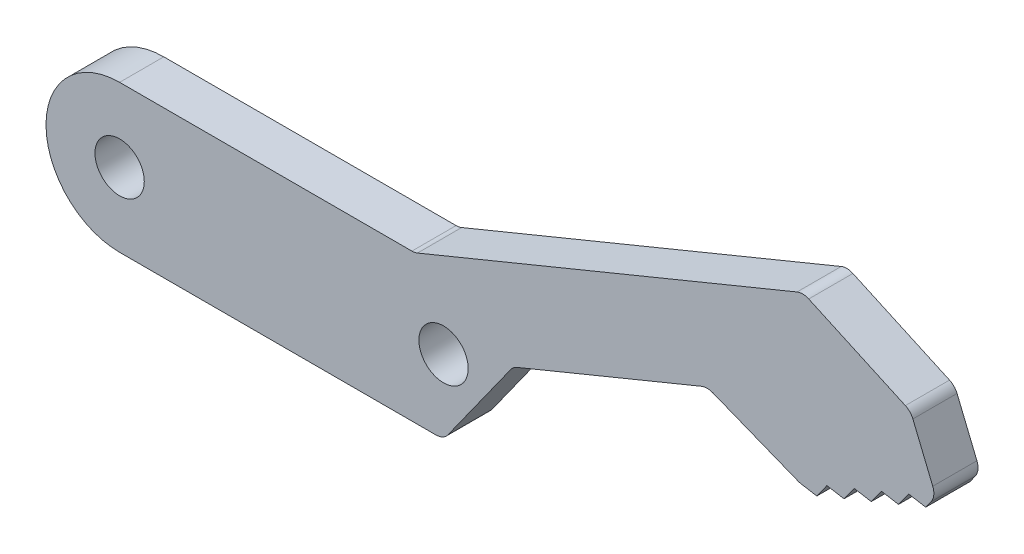
ISO-10303-21;
HEADER;
FILE_DESCRIPTION(('STEP AP214'),'2;1');
FILE_NAME('part.step','',(''),(''),'','','');
FILE_SCHEMA(('AUTOMOTIVE_DESIGN { 1 0 10303 214 1 1 1 1 }'));
ENDSEC;
DATA;
#1=APPLICATION_CONTEXT('core data for automotive mechanical design processes');
#2=APPLICATION_PROTOCOL_DEFINITION('international standard','automotive_design',2000,#1);
#3=PRODUCT_CONTEXT('',#1,'mechanical');
#4=PRODUCT('Part','Part','',(#3));
#5=PRODUCT_RELATED_PRODUCT_CATEGORY('part','',(#4));
#6=PRODUCT_DEFINITION_FORMATION('','',#4);
#7=PRODUCT_DEFINITION_CONTEXT('part definition',#1,'design');
#8=PRODUCT_DEFINITION('design','',#6,#7);
#9=PRODUCT_DEFINITION_SHAPE('','',#8);
#10=(LENGTH_UNIT() NAMED_UNIT(*) SI_UNIT(.MILLI.,.METRE.));
#11=(NAMED_UNIT(*) PLANE_ANGLE_UNIT() SI_UNIT($,.RADIAN.));
#12=(NAMED_UNIT(*) SI_UNIT($,.STERADIAN.) SOLID_ANGLE_UNIT());
#13=UNCERTAINTY_MEASURE_WITH_UNIT(LENGTH_MEASURE(1.E-05),#10,'distance_accuracy_value','');
#14=(GEOMETRIC_REPRESENTATION_CONTEXT(3) GLOBAL_UNCERTAINTY_ASSIGNED_CONTEXT((#13)) GLOBAL_UNIT_ASSIGNED_CONTEXT((#10,
#11,#12)) REPRESENTATION_CONTEXT('',''));
#15=CARTESIAN_POINT('',(0.,0.,0.));
#16=DIRECTION('',(0.,0.,1.));
#17=DIRECTION('',(1.,0.,0.));
#18=AXIS2_PLACEMENT_3D('',#15,#16,#17);
#19=CARTESIAN_POINT('',(16.9314341640704,-12.0952117619831,3.));
#20=DIRECTION('',(0.813703233651604,-0.581280523968353,0.));
#21=DIRECTION('',(0.581280523968353,0.813703233651604,0.));
#22=AXIS2_PLACEMENT_3D('',#19,#20,#21);
#23=PLANE('',#22);
#24=DIRECTION('',(-0.581280523968353,-0.813703233651604,0.));
#25=VECTOR('',#24,1.);
#26=CARTESIAN_POINT('',(16.9314341640704,-12.0952117619831,0.));
#27=LINE('',#26,#25);
#28=CARTESIAN_POINT('',(26.562618493048,1.38696338278467,0.));
#29=VERTEX_POINT('',#28);
#30=CARTESIAN_POINT('',(22.2991182366711,-4.58128052396835,0.));
#31=VERTEX_POINT('',#30);
#32=EDGE_CURVE('E330',#29,#31,#27,.T.);
#33=ORIENTED_EDGE('',*,*,#32,.F.);
#34=DIRECTION('',(0.,0.,-1.));
#35=VECTOR('',#34,1.);
#36=CARTESIAN_POINT('',(26.562618493048,1.38696338278467,3.));
#37=LINE('',#36,#35);
#38=CARTESIAN_POINT('',(26.562618493048,1.38696338278467,3.));
#39=VERTEX_POINT('',#38);
#40=EDGE_CURVE('E316',#29,#39,#37,.F.);
#41=ORIENTED_EDGE('',*,*,#40,.T.);
#42=DIRECTION('',(-0.581280523968353,-0.813703233651604,0.));
#43=VECTOR('',#42,1.);
#44=CARTESIAN_POINT('',(16.9314341640704,-12.0952117619831,3.));
#45=LINE('',#44,#43);
#46=CARTESIAN_POINT('',(22.2991182366711,-4.58128052396835,3.));
#47=VERTEX_POINT('',#46);
#48=EDGE_CURVE('E348',#39,#47,#45,.T.);
#49=ORIENTED_EDGE('',*,*,#48,.T.);
#50=DIRECTION('',(0.,0.,-1.));
#51=VECTOR('',#50,1.);
#52=CARTESIAN_POINT('',(22.2991182366711,-4.58128052396835,0.));
#53=LINE('',#52,#51);
#54=EDGE_CURVE('E313',#47,#31,#53,.T.);
#55=ORIENTED_EDGE('',*,*,#54,.T.);
#56=EDGE_LOOP('',(#33,#41,#49,#55));
#57=FACE_BOUND('',#56,.T.);
#58=ADVANCED_FACE('F49',(#57),#23,.T.);
#59=CARTESIAN_POINT('',(3.29500338314039,-8.01412070884607,3.));
#60=DIRECTION('',(0.380263412733207,-0.924878228166549,0.));
#61=DIRECTION('',(0.924878228166549,0.380263412733207,0.));
#62=AXIS2_PLACEMENT_3D('',#59,#60,#61);
#63=PLANE('',#62);
#64=DIRECTION('',(-0.924878228166549,-0.380263412733207,0.));
#65=VECTOR('',#64,1.);
#66=CARTESIAN_POINT('',(3.29500338314039,-8.01412070884607,0.));
#67=LINE('',#66,#65);
#68=CARTESIAN_POINT('',(39.5264893293259,6.88244413040183,0.));
#69=VERTEX_POINT('',#68);
#70=CARTESIAN_POINT('',(26.9960583139664,1.73056108698286,0.));
#71=VERTEX_POINT('',#70);
#72=EDGE_CURVE('E332',#69,#71,#67,.T.);
#73=ORIENTED_EDGE('',*,*,#72,.F.);
#74=DIRECTION('',(0.,0.,-1.));
#75=VECTOR('',#74,1.);
#76=CARTESIAN_POINT('',(39.5264893293259,6.88244413040184,3.));
#77=LINE('',#76,#75);
#78=CARTESIAN_POINT('',(39.5264893293259,6.88244413040183,3.));
#79=VERTEX_POINT('',#78);
#80=EDGE_CURVE('E311',#69,#79,#77,.F.);
#81=ORIENTED_EDGE('',*,*,#80,.T.);
#82=DIRECTION('',(-0.924878228166549,-0.380263412733207,0.));
#83=VECTOR('',#82,1.);
#84=CARTESIAN_POINT('',(3.29500338314039,-8.01412070884607,3.));
#85=LINE('',#84,#83);
#86=CARTESIAN_POINT('',(26.9960583139664,1.73056108698286,3.));
#87=VERTEX_POINT('',#86);
#88=EDGE_CURVE('E346',#79,#87,#85,.T.);
#89=ORIENTED_EDGE('',*,*,#88,.T.);
#90=DIRECTION('',(0.,0.,-1.));
#91=VECTOR('',#90,1.);
#92=CARTESIAN_POINT('',(26.9960583139664,1.73056108698286,0.));
#93=LINE('',#92,#91);
#94=EDGE_CURVE('E308',#87,#71,#93,.T.);
#95=ORIENTED_EDGE('',*,*,#94,.T.);
#96=EDGE_LOOP('',(#73,#81,#89,#95));
#97=FACE_BOUND('',#96,.T.);
#98=ADVANCED_FACE('F350',(#97),#63,.T.);
#99=CARTESIAN_POINT('',(7.84369243763637,19.7605066346556,3.));
#100=DIRECTION('',(-0.368935795459582,-0.929454882621317,0.));
#101=DIRECTION('',(0.929454882621317,-0.368935795459582,0.));
#102=AXIS2_PLACEMENT_3D('',#99,#100,#101);
#103=PLANE('',#102);
#104=DIRECTION('',(-0.929454882621317,0.368935795459582,0.));
#105=VECTOR('',#104,1.);
#106=CARTESIAN_POINT('',(7.84369243763637,19.7605066346556,0.));
#107=LINE('',#106,#105);
#108=CARTESIAN_POINT('',(46.0908425261848,4.57876623410547,0.));
#109=VERTEX_POINT('',#108);
#110=CARTESIAN_POINT('',(40.2756885375187,6.8870207848566,0.));
#111=VERTEX_POINT('',#110);
#112=EDGE_CURVE('E404',#109,#111,#107,.T.);
#113=ORIENTED_EDGE('',*,*,#112,.F.);
#114=DIRECTION('',(0.,0.,-1.));
#115=VECTOR('',#114,1.);
#116=CARTESIAN_POINT('',(46.0908425261848,4.57876623410548,3.));
#117=LINE('',#116,#115);
#118=CARTESIAN_POINT('',(46.0908425261848,4.57876623410547,3.));
#119=VERTEX_POINT('',#118);
#120=EDGE_CURVE('E277',#109,#119,#117,.F.);
#121=ORIENTED_EDGE('',*,*,#120,.T.);
#122=DIRECTION('',(-0.929454882621317,0.368935795459582,0.));
#123=VECTOR('',#122,1.);
#124=CARTESIAN_POINT('',(7.84369243763637,19.7605066346556,3.));
#125=LINE('',#124,#123);
#126=CARTESIAN_POINT('',(40.2756885375187,6.8870207848566,3.));
#127=VERTEX_POINT('',#126);
#128=EDGE_CURVE('E242',#119,#127,#125,.T.);
#129=ORIENTED_EDGE('',*,*,#128,.T.);
#130=DIRECTION('',(0.,0.,-1.));
#131=VECTOR('',#130,1.);
#132=CARTESIAN_POINT('',(40.2756885375187,6.8870207848566,0.));
#133=LINE('',#132,#131);
#134=EDGE_CURVE('E274',#127,#111,#133,.T.);
#135=ORIENTED_EDGE('',*,*,#134,.T.);
#136=EDGE_LOOP('',(#113,#121,#129,#135));
#137=FACE_BOUND('',#136,.T.);
#138=ADVANCED_FACE('F558',(#137),#103,.T.);
#139=CARTESIAN_POINT('',(2.04998063607053,12.0493696274544,3.));
#140=DIRECTION('',(0.167721751487352,0.985834374567054,0.));
#141=DIRECTION('',(-0.985834374567054,0.167721751487352,0.));
#142=AXIS2_PLACEMENT_3D('',#139,#140,#141);
#143=PLANE('',#142);
#144=DIRECTION('',(0.985834374567054,-0.167721751487352,0.));
#145=VECTOR('',#144,1.);
#146=CARTESIAN_POINT('',(2.04998063607053,12.0493696274544,3.));
#147=LINE('',#146,#145);
#148=CARTESIAN_POINT('',(46.2920565701571,4.52238674215974,3.));
#149=VERTEX_POINT('',#148);
#150=CARTESIAN_POINT('',(47.3510308865052,4.3422215625919,3.));
#151=VERTEX_POINT('',#150);
#152=EDGE_CURVE('E229',#149,#151,#147,.T.);
#153=ORIENTED_EDGE('',*,*,#152,.F.);
#154=DIRECTION('',(0.,0.,-1.));
#155=VECTOR('',#154,1.);
#156=CARTESIAN_POINT('',(46.2920565701571,4.52238674215974,0.));
#157=LINE('',#156,#155);
#158=CARTESIAN_POINT('',(46.2920565701571,4.52238674215974,0.));
#159=VERTEX_POINT('',#158);
#160=EDGE_CURVE('E257',#149,#159,#157,.T.);
#161=ORIENTED_EDGE('',*,*,#160,.T.);
#162=DIRECTION('',(0.985834374567054,-0.167721751487352,0.));
#163=VECTOR('',#162,1.);
#164=CARTESIAN_POINT('',(2.04998063607053,12.0493696274544,0.));
#165=LINE('',#164,#163);
#166=CARTESIAN_POINT('',(47.3510308865052,4.3422215625919,0.));
#167=VERTEX_POINT('',#166);
#168=EDGE_CURVE('E255',#159,#167,#165,.T.);
#169=ORIENTED_EDGE('',*,*,#168,.T.);
#170=DIRECTION('',(0.,0.,-1.));
#171=VECTOR('',#170,1.);
#172=CARTESIAN_POINT('',(47.3510308865052,4.3422215625919,3.));
#173=LINE('',#172,#171);
#174=EDGE_CURVE('E248',#151,#167,#173,.T.);
#175=ORIENTED_EDGE('',*,*,#174,.F.);
#176=EDGE_LOOP('',(#153,#161,#169,#175));
#177=FACE_BOUND('',#176,.T.);
#178=ADVANCED_FACE('F253',(#177),#143,.F.);
#179=CARTESIAN_POINT('',(29.2140395089282,-20.9496267653803,3.));
#180=DIRECTION('',(-0.812647209633238,0.582755963225871,0.));
#181=DIRECTION('',(-0.582755963225871,-0.812647209633238,0.));
#182=AXIS2_PLACEMENT_3D('',#179,#180,#181);
#183=PLANE('',#182);
#184=DIRECTION('',(0.582755963225871,0.812647209633238,0.));
#185=VECTOR('',#184,1.);
#186=CARTESIAN_POINT('',(29.2140395089282,-20.9496267653803,0.));
#187=LINE('',#186,#185);
#188=CARTESIAN_POINT('',(48.0382444817135,5.3005338679292,0.));
#189=VERTEX_POINT('',#188);
#190=EDGE_CURVE('E408',#167,#189,#187,.T.);
#191=ORIENTED_EDGE('',*,*,#190,.T.);
#192=DIRECTION('',(0.,0.,-1.));
#193=VECTOR('',#192,1.);
#194=CARTESIAN_POINT('',(48.0382444817135,5.3005338679292,3.));
#195=LINE('',#194,#193);
#196=CARTESIAN_POINT('',(48.0382444817135,5.3005338679292,3.));
#197=VERTEX_POINT('',#196);
#198=EDGE_CURVE('E250',#197,#189,#195,.T.);
#199=ORIENTED_EDGE('',*,*,#198,.F.);
#200=DIRECTION('',(0.582755963225871,0.812647209633238,0.));
#201=VECTOR('',#200,1.);
#202=CARTESIAN_POINT('',(29.2140395089282,-20.9496267653803,3.));
#203=LINE('',#202,#201);
#204=EDGE_CURVE('E234',#151,#197,#203,.T.);
#205=ORIENTED_EDGE('',*,*,#204,.F.);
#206=ORIENTED_EDGE('',*,*,#174,.T.);
#207=EDGE_LOOP('',(#191,#199,#205,#206));
#208=FACE_BOUND('',#207,.T.);
#209=ADVANCED_FACE('F247',(#208),#183,.F.);
#210=CARTESIAN_POINT('',(2.22776533707793,13.0943519745326,3.));
#211=DIRECTION('',(0.167721751487345,0.985834374567055,0.));
#212=DIRECTION('',(-0.985834374567056,0.167721751487345,0.));
#213=AXIS2_PLACEMENT_3D('',#210,#211,#212);
#214=PLANE('',#213);
#215=DIRECTION('',(0.985834374567055,-0.167721751487345,0.));
#216=VECTOR('',#215,1.);
#217=CARTESIAN_POINT('',(2.22776533707793,13.0943519745326,0.));
#218=LINE('',#217,#216);
#219=CARTESIAN_POINT('',(49.2007873428382,5.10274838805831,0.));
#220=VERTEX_POINT('',#219);
#221=EDGE_CURVE('E410',#189,#220,#218,.T.);
#222=ORIENTED_EDGE('',*,*,#221,.T.);
#223=DIRECTION('',(0.,0.,-1.));
#224=VECTOR('',#223,1.);
#225=CARTESIAN_POINT('',(49.2007873428382,5.10274838805831,3.));
#226=LINE('',#225,#224);
#227=CARTESIAN_POINT('',(49.2007873428382,5.10274838805831,3.));
#228=VERTEX_POINT('',#227);
#229=EDGE_CURVE('E261',#228,#220,#226,.T.);
#230=ORIENTED_EDGE('',*,*,#229,.F.);
#231=DIRECTION('',(0.985834374567055,-0.167721751487345,0.));
#232=VECTOR('',#231,1.);
#233=CARTESIAN_POINT('',(2.22776533707793,13.0943519745326,3.));
#234=LINE('',#233,#232);
#235=EDGE_CURVE('E251',#197,#228,#234,.T.);
#236=ORIENTED_EDGE('',*,*,#235,.F.);
#237=ORIENTED_EDGE('',*,*,#198,.T.);
#238=EDGE_LOOP('',(#222,#230,#236,#237));
#239=FACE_BOUND('',#238,.T.);
#240=ADVANCED_FACE('F479',(#239),#214,.F.);
#241=CARTESIAN_POINT('',(30.0754438283324,-21.5673468509608,3.));
#242=DIRECTION('',(-0.812647209633237,0.582755963225872,0.));
#243=DIRECTION('',(-0.582755963225872,-0.812647209633237,0.));
#244=AXIS2_PLACEMENT_3D('',#241,#242,#243);
#245=PLANE('',#244);
#246=DIRECTION('',(0.582755963225872,0.812647209633237,0.));
#247=VECTOR('',#246,1.);
#248=CARTESIAN_POINT('',(30.0754438283324,-21.5673468509608,0.));
#249=LINE('',#248,#247);
#250=CARTESIAN_POINT('',(49.8880009380465,6.06106069339562,0.));
#251=VERTEX_POINT('',#250);
#252=EDGE_CURVE('E413',#220,#251,#249,.T.);
#253=ORIENTED_EDGE('',*,*,#252,.T.);
#254=DIRECTION('',(0.,0.,-1.));
#255=VECTOR('',#254,1.);
#256=CARTESIAN_POINT('',(49.8880009380465,6.06106069339562,3.));
#257=LINE('',#256,#255);
#258=CARTESIAN_POINT('',(49.8880009380465,6.06106069339562,3.));
#259=VERTEX_POINT('',#258);
#260=EDGE_CURVE('E471',#259,#251,#257,.T.);
#261=ORIENTED_EDGE('',*,*,#260,.F.);
#262=DIRECTION('',(0.582755963225872,0.812647209633237,0.));
#263=VECTOR('',#262,1.);
#264=CARTESIAN_POINT('',(30.0754438283324,-21.5673468509608,3.));
#265=LINE('',#264,#263);
#266=EDGE_CURVE('E360',#228,#259,#265,.T.);
#267=ORIENTED_EDGE('',*,*,#266,.F.);
#268=ORIENTED_EDGE('',*,*,#229,.T.);
#269=EDGE_LOOP('',(#253,#261,#267,#268));
#270=FACE_BOUND('',#269,.T.);
#271=ADVANCED_FACE('F476',(#270),#245,.F.);
#272=CARTESIAN_POINT('',(2.40555003808549,14.1393343216111,3.));
#273=DIRECTION('',(0.167721751487346,0.985834374567055,0.));
#274=DIRECTION('',(-0.985834374567055,0.167721751487346,0.));
#275=AXIS2_PLACEMENT_3D('',#272,#273,#274);
#276=PLANE('',#275);
#277=DIRECTION('',(0.985834374567055,-0.167721751487346,0.));
#278=VECTOR('',#277,1.);
#279=CARTESIAN_POINT('',(2.40555003808549,14.1393343216111,0.));
#280=LINE('',#279,#278);
#281=CARTESIAN_POINT('',(51.0505437991714,5.86327521352473,0.));
#282=VERTEX_POINT('',#281);
#283=EDGE_CURVE('E416',#251,#282,#280,.T.);
#284=ORIENTED_EDGE('',*,*,#283,.T.);
#285=DIRECTION('',(0.,0.,-1.));
#286=VECTOR('',#285,1.);
#287=CARTESIAN_POINT('',(51.0505437991714,5.86327521352473,3.));
#288=LINE('',#287,#286);
#289=CARTESIAN_POINT('',(51.0505437991714,5.86327521352473,3.));
#290=VERTEX_POINT('',#289);
#291=EDGE_CURVE('E468',#290,#282,#288,.T.);
#292=ORIENTED_EDGE('',*,*,#291,.F.);
#293=DIRECTION('',(0.985834374567055,-0.167721751487346,0.));
#294=VECTOR('',#293,1.);
#295=CARTESIAN_POINT('',(2.40555003808549,14.1393343216111,3.));
#296=LINE('',#295,#294);
#297=EDGE_CURVE('E363',#259,#290,#296,.T.);
#298=ORIENTED_EDGE('',*,*,#297,.F.);
#299=ORIENTED_EDGE('',*,*,#260,.T.);
#300=EDGE_LOOP('',(#284,#292,#298,#299));
#301=FACE_BOUND('',#300,.T.);
#302=ADVANCED_FACE('F482',(#301),#276,.F.);
#303=CARTESIAN_POINT('',(30.9368481477369,-22.1850669365412,3.));
#304=DIRECTION('',(-0.812647209633239,0.582755963225869,0.));
#305=DIRECTION('',(-0.582755963225869,-0.812647209633239,0.));
#306=AXIS2_PLACEMENT_3D('',#303,#304,#305);
#307=PLANE('',#306);
#308=DIRECTION('',(0.582755963225869,0.812647209633239,0.));
#309=VECTOR('',#308,1.);
#310=CARTESIAN_POINT('',(30.9368481477369,-22.1850669365412,0.));
#311=LINE('',#310,#309);
#312=CARTESIAN_POINT('',(51.7377573943796,6.82158751886203,0.));
#313=VERTEX_POINT('',#312);
#314=EDGE_CURVE('E419',#282,#313,#311,.T.);
#315=ORIENTED_EDGE('',*,*,#314,.T.);
#316=DIRECTION('',(0.,0.,-1.));
#317=VECTOR('',#316,1.);
#318=CARTESIAN_POINT('',(51.7377573943796,6.82158751886203,3.));
#319=LINE('',#318,#317);
#320=CARTESIAN_POINT('',(51.7377573943796,6.82158751886203,3.));
#321=VERTEX_POINT('',#320);
#322=EDGE_CURVE('E465',#321,#313,#319,.T.);
#323=ORIENTED_EDGE('',*,*,#322,.F.);
#324=DIRECTION('',(0.582755963225869,0.812647209633239,0.));
#325=VECTOR('',#324,1.);
#326=CARTESIAN_POINT('',(30.9368481477369,-22.1850669365412,3.));
#327=LINE('',#326,#325);
#328=EDGE_CURVE('E366',#290,#321,#327,.T.);
#329=ORIENTED_EDGE('',*,*,#328,.F.);
#330=ORIENTED_EDGE('',*,*,#291,.T.);
#331=EDGE_LOOP('',(#315,#323,#329,#330));
#332=FACE_BOUND('',#331,.T.);
#333=ADVANCED_FACE('F486',(#332),#307,.F.);
#334=CARTESIAN_POINT('',(2.58333473909304,15.1843166686896,3.));
#335=DIRECTION('',(0.167721751487346,0.985834374567055,0.));
#336=DIRECTION('',(-0.985834374567055,0.167721751487346,0.));
#337=AXIS2_PLACEMENT_3D('',#334,#335,#336);
#338=PLANE('',#337);
#339=DIRECTION('',(0.985834374567055,-0.167721751487346,0.));
#340=VECTOR('',#339,1.);
#341=CARTESIAN_POINT('',(2.58333473909304,15.1843166686896,0.));
#342=LINE('',#341,#340);
#343=CARTESIAN_POINT('',(52.9003002555045,6.62380203899114,0.));
#344=VERTEX_POINT('',#343);
#345=EDGE_CURVE('E422',#313,#344,#342,.T.);
#346=ORIENTED_EDGE('',*,*,#345,.T.);
#347=DIRECTION('',(0.,0.,-1.));
#348=VECTOR('',#347,1.);
#349=CARTESIAN_POINT('',(52.9003002555045,6.62380203899114,3.));
#350=LINE('',#349,#348);
#351=CARTESIAN_POINT('',(52.9003002555045,6.62380203899114,3.));
#352=VERTEX_POINT('',#351);
#353=EDGE_CURVE('E462',#352,#344,#350,.T.);
#354=ORIENTED_EDGE('',*,*,#353,.F.);
#355=DIRECTION('',(0.985834374567055,-0.167721751487346,0.));
#356=VECTOR('',#355,1.);
#357=CARTESIAN_POINT('',(2.58333473909304,15.1843166686896,3.));
#358=LINE('',#357,#356);
#359=EDGE_CURVE('E369',#321,#352,#358,.T.);
#360=ORIENTED_EDGE('',*,*,#359,.F.);
#361=ORIENTED_EDGE('',*,*,#322,.T.);
#362=EDGE_LOOP('',(#346,#354,#360,#361));
#363=FACE_BOUND('',#362,.T.);
#364=ADVANCED_FACE('F488',(#363),#338,.F.);
#365=CARTESIAN_POINT('',(31.7982524671406,-22.8027870221219,3.));
#366=DIRECTION('',(-0.812647209633232,0.582755963225879,0.));
#367=DIRECTION('',(-0.582755963225879,-0.812647209633232,0.));
#368=AXIS2_PLACEMENT_3D('',#365,#366,#367);
#369=PLANE('',#368);
#370=DIRECTION('',(0.582755963225879,0.812647209633232,0.));
#371=VECTOR('',#370,1.);
#372=CARTESIAN_POINT('',(31.7982524671406,-22.8027870221219,0.));
#373=LINE('',#372,#371);
#374=CARTESIAN_POINT('',(53.5875138507128,7.58211434432844,0.));
#375=VERTEX_POINT('',#374);
#376=EDGE_CURVE('E425',#344,#375,#373,.T.);
#377=ORIENTED_EDGE('',*,*,#376,.T.);
#378=DIRECTION('',(0.,0.,-1.));
#379=VECTOR('',#378,1.);
#380=CARTESIAN_POINT('',(53.5875138507128,7.58211434432844,3.));
#381=LINE('',#380,#379);
#382=CARTESIAN_POINT('',(53.5875138507128,7.58211434432844,3.));
#383=VERTEX_POINT('',#382);
#384=EDGE_CURVE('E459',#383,#375,#381,.T.);
#385=ORIENTED_EDGE('',*,*,#384,.F.);
#386=DIRECTION('',(0.582755963225879,0.812647209633232,0.));
#387=VECTOR('',#386,1.);
#388=CARTESIAN_POINT('',(31.7982524671406,-22.8027870221219,3.));
#389=LINE('',#388,#387);
#390=EDGE_CURVE('E372',#352,#383,#389,.T.);
#391=ORIENTED_EDGE('',*,*,#390,.F.);
#392=ORIENTED_EDGE('',*,*,#353,.T.);
#393=EDGE_LOOP('',(#377,#385,#391,#392));
#394=FACE_BOUND('',#393,.T.);
#395=ADVANCED_FACE('F490',(#394),#369,.F.);
#396=CARTESIAN_POINT('',(2.7611194401007,16.2292990157683,3.));
#397=DIRECTION('',(0.167721751487351,0.985834374567054,0.));
#398=DIRECTION('',(-0.985834374567055,0.167721751487351,0.));
#399=AXIS2_PLACEMENT_3D('',#396,#397,#398);
#400=PLANE('',#399);
#401=DIRECTION('',(0.985834374567055,-0.167721751487351,0.));
#402=VECTOR('',#401,1.);
#403=CARTESIAN_POINT('',(2.7611194401007,16.2292990157683,0.));
#404=LINE('',#403,#402);
#405=CARTESIAN_POINT('',(54.7500567118375,7.38432886445755,0.));
#406=VERTEX_POINT('',#405);
#407=EDGE_CURVE('E428',#375,#406,#404,.T.);
#408=ORIENTED_EDGE('',*,*,#407,.T.);
#409=DIRECTION('',(0.,0.,-1.));
#410=VECTOR('',#409,1.);
#411=CARTESIAN_POINT('',(54.7500567118375,7.38432886445755,3.));
#412=LINE('',#411,#410);
#413=CARTESIAN_POINT('',(54.7500567118375,7.38432886445755,3.));
#414=VERTEX_POINT('',#413);
#415=EDGE_CURVE('E456',#414,#406,#412,.T.);
#416=ORIENTED_EDGE('',*,*,#415,.F.);
#417=DIRECTION('',(0.985834374567055,-0.167721751487351,0.));
#418=VECTOR('',#417,1.);
#419=CARTESIAN_POINT('',(2.7611194401007,16.2292990157683,3.));
#420=LINE('',#419,#418);
#421=EDGE_CURVE('E375',#383,#414,#420,.T.);
#422=ORIENTED_EDGE('',*,*,#421,.F.);
#423=ORIENTED_EDGE('',*,*,#384,.T.);
#424=EDGE_LOOP('',(#408,#416,#422,#423));
#425=FACE_BOUND('',#424,.T.);
#426=ADVANCED_FACE('F495',(#425),#400,.F.);
#427=CARTESIAN_POINT('',(32.6596567865455,-23.4205071077022,3.));
#428=DIRECTION('',(-0.812647209633238,0.58275596322587,0.));
#429=DIRECTION('',(-0.58275596322587,-0.812647209633238,0.));
#430=AXIS2_PLACEMENT_3D('',#427,#428,#429);
#431=PLANE('',#430);
#432=DIRECTION('',(0.58275596322587,0.812647209633238,0.));
#433=VECTOR('',#432,1.);
#434=CARTESIAN_POINT('',(32.6596567865455,-23.4205071077022,0.));
#435=LINE('',#434,#433);
#436=CARTESIAN_POINT('',(55.1142791888537,7.89223337047834,0.));
#437=VERTEX_POINT('',#436);
#438=EDGE_CURVE('E431',#406,#437,#435,.T.);
#439=ORIENTED_EDGE('',*,*,#438,.T.);
#440=DIRECTION('',(0.,0.,-1.));
#441=VECTOR('',#440,1.);
#442=CARTESIAN_POINT('',(55.1142791888537,7.89223337047834,3.));
#443=LINE('',#442,#441);
#444=CARTESIAN_POINT('',(55.1142791888537,7.89223337047834,3.));
#445=VERTEX_POINT('',#444);
#446=EDGE_CURVE('E293',#437,#445,#443,.F.);
#447=ORIENTED_EDGE('',*,*,#446,.T.);
#448=DIRECTION('',(0.58275596322587,0.812647209633238,0.));
#449=VECTOR('',#448,1.);
#450=CARTESIAN_POINT('',(32.6596567865455,-23.4205071077022,3.));
#451=LINE('',#450,#449);
#452=EDGE_CURVE('E378',#414,#445,#451,.T.);
#453=ORIENTED_EDGE('',*,*,#452,.F.);
#454=ORIENTED_EDGE('',*,*,#415,.T.);
#455=EDGE_LOOP('',(#439,#447,#453,#454));
#456=FACE_BOUND('',#455,.T.);
#457=ADVANCED_FACE('F497',(#456),#431,.F.);
#458=CARTESIAN_POINT('',(50.3551112402657,20.7034892439219,3.));
#459=DIRECTION('',(0.924878228166549,0.380263412733207,0.));
#460=DIRECTION('',(-0.380263412733207,0.924878228166549,0.));
#461=AXIS2_PLACEMENT_3D('',#458,#459,#460);
#462=PLANE('',#461);
#463=DIRECTION('',(0.380263412733207,-0.924878228166549,0.));
#464=VECTOR('',#463,1.);
#465=CARTESIAN_POINT('',(50.3551112402657,20.7034892439219,3.));
#466=LINE('',#465,#464);
#467=CARTESIAN_POINT('',(53.8764912996726,12.138774256918,3.));
#468=VERTEX_POINT('',#467);
#469=CARTESIAN_POINT('',(55.226510207387,8.85525274643741,3.));
#470=VERTEX_POINT('',#469);
#471=EDGE_CURVE('E381',#468,#470,#466,.T.);
#472=ORIENTED_EDGE('',*,*,#471,.T.);
#473=DIRECTION('',(0.,0.,-1.));
#474=VECTOR('',#473,1.);
#475=CARTESIAN_POINT('',(55.226510207387,8.85525274643742,0.));
#476=LINE('',#475,#474);
#477=CARTESIAN_POINT('',(55.226510207387,8.85525274643741,0.));
#478=VERTEX_POINT('',#477);
#479=EDGE_CURVE('E290',#470,#478,#476,.T.);
#480=ORIENTED_EDGE('',*,*,#479,.T.);
#481=DIRECTION('',(0.380263412733207,-0.924878228166549,0.));
#482=VECTOR('',#481,1.);
#483=CARTESIAN_POINT('',(50.3551112402657,20.7034892439219,0.));
#484=LINE('',#483,#482);
#485=CARTESIAN_POINT('',(53.8764912996726,12.138774256918,0.));
#486=VERTEX_POINT('',#485);
#487=EDGE_CURVE('E434',#486,#478,#484,.T.);
#488=ORIENTED_EDGE('',*,*,#487,.F.);
#489=DIRECTION('',(0.,0.,-1.));
#490=VECTOR('',#489,1.);
#491=CARTESIAN_POINT('',(53.8764912996726,12.138774256918,3.));
#492=LINE('',#491,#490);
#493=EDGE_CURVE('E288',#486,#468,#492,.F.);
#494=ORIENTED_EDGE('',*,*,#493,.T.);
#495=EDGE_LOOP('',(#472,#480,#488,#494));
#496=FACE_BOUND('',#495,.T.);
#497=ADVANCED_FACE('F505',(#496),#462,.T.);
#498=CARTESIAN_POINT('',(13.9488099268582,30.6231164748253,3.));
#499=DIRECTION('',(0.414522259932085,0.910039172794664,0.));
#500=DIRECTION('',(-0.910039172794664,0.414522259932085,0.));
#501=AXIS2_PLACEMENT_3D('',#498,#499,#500);
#502=PLANE('',#501);
#503=DIRECTION('',(0.910039172794664,-0.414522259932085,0.));
#504=VECTOR('',#503,1.);
#505=CARTESIAN_POINT('',(13.9488099268582,30.6231164748253,3.));
#506=LINE('',#505,#504);
#507=CARTESIAN_POINT('',(46.8032086062433,15.6579589338968,3.));
#508=VERTEX_POINT('',#507);
#509=CARTESIAN_POINT('',(53.3661353314382,12.6685500169795,3.));
#510=VERTEX_POINT('',#509);
#511=EDGE_CURVE('E384',#508,#510,#506,.T.);
#512=ORIENTED_EDGE('',*,*,#511,.T.);
#513=DIRECTION('',(0.,0.,-1.));
#514=VECTOR('',#513,1.);
#515=CARTESIAN_POINT('',(53.3661353314382,12.6685500169795,3.));
#516=LINE('',#515,#514);
#517=CARTESIAN_POINT('',(53.3661353314382,12.6685500169795,0.));
#518=VERTEX_POINT('',#517);
#519=EDGE_CURVE('E297',#510,#518,#516,.T.);
#520=ORIENTED_EDGE('',*,*,#519,.T.);
#521=DIRECTION('',(0.910039172794664,-0.414522259932085,0.));
#522=VECTOR('',#521,1.);
#523=CARTESIAN_POINT('',(13.9488099268582,30.6231164748253,0.));
#524=LINE('',#523,#522);
#525=CARTESIAN_POINT('',(46.8032086062433,15.6579589338968,0.));
#526=VERTEX_POINT('',#525);
#527=EDGE_CURVE('E437',#526,#518,#524,.T.);
#528=ORIENTED_EDGE('',*,*,#527,.F.);
#529=DIRECTION('',(0.,0.,-1.));
#530=VECTOR('',#529,1.);
#531=CARTESIAN_POINT('',(46.8032086062433,15.6579589338968,3.));
#532=LINE('',#531,#530);
#533=EDGE_CURVE('E295',#526,#508,#532,.F.);
#534=ORIENTED_EDGE('',*,*,#533,.T.);
#535=EDGE_LOOP('',(#512,#520,#528,#534));
#536=FACE_BOUND('',#535,.T.);
#537=ADVANCED_FACE('F514',(#536),#502,.T.);
#538=CARTESIAN_POINT('',(1.14074851739701,-2.77453321099285,3.));
#539=DIRECTION('',(-0.380263412733206,0.924878228166549,0.));
#540=DIRECTION('',(-0.924878228166549,-0.380263412733206,0.));
#541=AXIS2_PLACEMENT_3D('',#538,#539,#540);
#542=PLANE('',#541);
#543=DIRECTION('',(0.924878228166549,0.380263412733206,0.));
#544=VECTOR('',#543,1.);
#545=CARTESIAN_POINT('',(1.14074851739701,-2.77453321099285,3.));
#546=LINE('',#545,#544);
#547=CARTESIAN_POINT('',(20.2327114807882,5.07512177183345,3.));
#548=VERTEX_POINT('',#547);
#549=CARTESIAN_POINT('',(46.0084229335781,15.6727979892687,3.));
#550=VERTEX_POINT('',#549);
#551=EDGE_CURVE('E387',#548,#550,#546,.T.);
#552=ORIENTED_EDGE('',*,*,#551,.T.);
#553=DIRECTION('',(0.,0.,-1.));
#554=VECTOR('',#553,1.);
#555=CARTESIAN_POINT('',(46.0084229335781,15.6727979892687,3.));
#556=LINE('',#555,#554);
#557=CARTESIAN_POINT('',(46.0084229335781,15.6727979892687,0.));
#558=VERTEX_POINT('',#557);
#559=EDGE_CURVE('E302',#550,#558,#556,.T.);
#560=ORIENTED_EDGE('',*,*,#559,.T.);
#561=DIRECTION('',(0.924878228166549,0.380263412733206,0.));
#562=VECTOR('',#561,1.);
#563=CARTESIAN_POINT('',(1.14074851739701,-2.77453321099285,0.));
#564=LINE('',#563,#562);
#565=CARTESIAN_POINT('',(20.2327114807882,5.07512177183345,0.));
#566=VERTEX_POINT('',#565);
#567=EDGE_CURVE('E440',#566,#558,#564,.T.);
#568=ORIENTED_EDGE('',*,*,#567,.F.);
#569=DIRECTION('',(0.,0.,-1.));
#570=VECTOR('',#569,1.);
#571=CARTESIAN_POINT('',(20.2327114807882,5.07512177183345,3.));
#572=LINE('',#571,#570);
#573=EDGE_CURVE('E300',#566,#548,#572,.F.);
#574=ORIENTED_EDGE('',*,*,#573,.T.);
#575=EDGE_LOOP('',(#552,#560,#568,#574));
#576=FACE_BOUND('',#575,.T.);
#577=ADVANCED_FACE('F521',(#576),#542,.T.);
#578=CARTESIAN_POINT('',(0.,5.,3.));
#579=DIRECTION('',(0.,1.,0.));
#580=DIRECTION('',(0.,0.,1.));
#581=AXIS2_PLACEMENT_3D('',#578,#579,#580);
#582=PLANE('',#581);
#583=DIRECTION('',(1.,0.,0.));
#584=VECTOR('',#583,1.);
#585=CARTESIAN_POINT('',(0.,5.,3.));
#586=LINE('',#585,#584);
#587=CARTESIAN_POINT('',(0.,5.,3.));
#588=VERTEX_POINT('',#587);
#589=CARTESIAN_POINT('',(19.852448068055,5.,3.));
#590=VERTEX_POINT('',#589);
#591=EDGE_CURVE('E390',#588,#590,#586,.T.);
#592=ORIENTED_EDGE('',*,*,#591,.T.);
#593=DIRECTION('',(0.,0.,-1.));
#594=VECTOR('',#593,1.);
#595=CARTESIAN_POINT('',(19.852448068055,5.,0.));
#596=LINE('',#595,#594);
#597=CARTESIAN_POINT('',(19.852448068055,5.,0.));
#598=VERTEX_POINT('',#597);
#599=EDGE_CURVE('E305',#590,#598,#596,.T.);
#600=ORIENTED_EDGE('',*,*,#599,.T.);
#601=DIRECTION('',(1.,0.,0.));
#602=VECTOR('',#601,1.);
#603=CARTESIAN_POINT('',(0.,5.,0.));
#604=LINE('',#603,#602);
#605=CARTESIAN_POINT('',(0.,5.,0.));
#606=VERTEX_POINT('',#605);
#607=EDGE_CURVE('E443',#606,#598,#604,.T.);
#608=ORIENTED_EDGE('',*,*,#607,.F.);
#609=DIRECTION('',(0.,0.,-1.));
#610=VECTOR('',#609,1.);
#611=CARTESIAN_POINT('',(0.,5.,3.));
#612=LINE('',#611,#610);
#613=EDGE_CURVE('E454',#588,#606,#612,.T.);
#614=ORIENTED_EDGE('',*,*,#613,.F.);
#615=EDGE_LOOP('',(#592,#600,#608,#614));
#616=FACE_BOUND('',#615,.T.);
#617=ADVANCED_FACE('F529',(#616),#582,.T.);
#618=CARTESIAN_POINT('',(0.,0.,3.));
#619=DIRECTION('',(0.,0.,-1.));
#620=DIRECTION('',(-1.,0.,0.));
#621=AXIS2_PLACEMENT_3D('',#618,#619,#620);
#622=CYLINDRICAL_SURFACE('',#621,5.);
#623=CARTESIAN_POINT('',(0.,0.,0.));
#624=DIRECTION('',(0.,0.,1.));
#625=DIRECTION('',(1.,0.,0.));
#626=AXIS2_PLACEMENT_3D('',#623,#624,#625);
#627=CIRCLE('',#626,5.);
#628=CARTESIAN_POINT('',(0.,-5.,0.));
#629=VERTEX_POINT('',#628);
#630=EDGE_CURVE('E446',#606,#629,#627,.T.);
#631=ORIENTED_EDGE('',*,*,#630,.T.);
#632=DIRECTION('',(0.,0.,-1.));
#633=VECTOR('',#632,1.);
#634=CARTESIAN_POINT('',(0.,-5.,3.));
#635=LINE('',#634,#633);
#636=CARTESIAN_POINT('',(0.,-5.,3.));
#637=VERTEX_POINT('',#636);
#638=EDGE_CURVE('E397',#637,#629,#635,.T.);
#639=ORIENTED_EDGE('',*,*,#638,.F.);
#640=CARTESIAN_POINT('',(0.,0.,3.));
#641=DIRECTION('',(0.,0.,1.));
#642=DIRECTION('',(1.,0.,0.));
#643=AXIS2_PLACEMENT_3D('',#640,#641,#642);
#644=CIRCLE('',#643,5.);
#645=EDGE_CURVE('E392',#588,#637,#644,.T.);
#646=ORIENTED_EDGE('',*,*,#645,.F.);
#647=ORIENTED_EDGE('',*,*,#613,.T.);
#648=EDGE_LOOP('',(#631,#639,#646,#647));
#649=FACE_BOUND('',#648,.T.);
#650=ADVANCED_FACE('F533',(#649),#622,.T.);
#651=CARTESIAN_POINT('',(0.,0.,3.));
#652=DIRECTION('',(0.,0.,-1.));
#653=DIRECTION('',(-1.,0.,0.));
#654=AXIS2_PLACEMENT_3D('',#651,#652,#653);
#655=CYLINDRICAL_SURFACE('',#654,1.675);
#656=CARTESIAN_POINT('',(0.,0.,3.));
#657=DIRECTION('',(0.,0.,1.));
#658=DIRECTION('',(1.,0.,0.));
#659=AXIS2_PLACEMENT_3D('',#656,#657,#658);
#660=CIRCLE('',#659,1.675);
#661=CARTESIAN_POINT('',(1.675,0.,3.));
#662=VERTEX_POINT('',#661);
#663=EDGE_CURVE('E355',#662,#662,#660,.T.);
#664=ORIENTED_EDGE('',*,*,#663,.T.);
#665=EDGE_LOOP('',(#664));
#666=FACE_BOUND('',#665,.T.);
#667=CARTESIAN_POINT('',(0.,0.,0.));
#668=DIRECTION('',(0.,0.,1.));
#669=DIRECTION('',(1.,0.,0.));
#670=AXIS2_PLACEMENT_3D('',#667,#668,#669);
#671=CIRCLE('',#670,1.675);
#672=CARTESIAN_POINT('',(1.675,0.,0.));
#673=VERTEX_POINT('',#672);
#674=EDGE_CURVE('E340',#673,#673,#671,.T.);
#675=ORIENTED_EDGE('',*,*,#674,.F.);
#676=EDGE_LOOP('',(#675));
#677=FACE_BOUND('',#676,.T.);
#678=ADVANCED_FACE('F548',(#666,#677),#655,.F.);
#679=CARTESIAN_POINT('',(22.,0.,3.));
#680=DIRECTION('',(0.,0.,-1.));
#681=DIRECTION('',(-1.,0.,0.));
#682=AXIS2_PLACEMENT_3D('',#679,#680,#681);
#683=CYLINDRICAL_SURFACE('',#682,1.675);
#684=CARTESIAN_POINT('',(22.,0.,3.));
#685=DIRECTION('',(0.,0.,1.));
#686=DIRECTION('',(1.,0.,0.));
#687=AXIS2_PLACEMENT_3D('',#684,#685,#686);
#688=CIRCLE('',#687,1.675);
#689=CARTESIAN_POINT('',(23.675,0.,3.));
#690=VERTEX_POINT('',#689);
#691=EDGE_CURVE('E451',#690,#690,#688,.T.);
#692=ORIENTED_EDGE('',*,*,#691,.T.);
#693=EDGE_LOOP('',(#692));
#694=FACE_BOUND('',#693,.T.);
#695=CARTESIAN_POINT('',(22.,0.,0.));
#696=DIRECTION('',(0.,0.,1.));
#697=DIRECTION('',(1.,0.,0.));
#698=AXIS2_PLACEMENT_3D('',#695,#696,#697);
#699=CIRCLE('',#698,1.675);
#700=CARTESIAN_POINT('',(23.675,0.,0.));
#701=VERTEX_POINT('',#700);
#702=EDGE_CURVE('E398',#701,#701,#699,.T.);
#703=ORIENTED_EDGE('',*,*,#702,.F.);
#704=EDGE_LOOP('',(#703));
#705=FACE_BOUND('',#704,.T.);
#706=ADVANCED_FACE('F539',(#694,#705),#683,.F.);
#707=CARTESIAN_POINT('',(0.,-5.,3.));
#708=DIRECTION('',(0.,1.,0.));
#709=DIRECTION('',(0.,0.,1.));
#710=AXIS2_PLACEMENT_3D('',#707,#708,#709);
#711=PLANE('',#710);
#712=DIRECTION('',(1.,0.,0.));
#713=VECTOR('',#712,1.);
#714=CARTESIAN_POINT('',(0.,-5.,0.));
#715=LINE('',#714,#713);
#716=CARTESIAN_POINT('',(21.4854150030195,-5.,0.));
#717=VERTEX_POINT('',#716);
#718=EDGE_CURVE('E449',#629,#717,#715,.T.);
#719=ORIENTED_EDGE('',*,*,#718,.T.);
#720=DIRECTION('',(0.,0.,-1.));
#721=VECTOR('',#720,1.);
#722=CARTESIAN_POINT('',(21.4854150030195,-5.,3.));
#723=LINE('',#722,#721);
#724=CARTESIAN_POINT('',(21.4854150030195,-5.,3.));
#725=VERTEX_POINT('',#724);
#726=EDGE_CURVE('E64',#717,#725,#723,.F.);
#727=ORIENTED_EDGE('',*,*,#726,.T.);
#728=DIRECTION('',(1.,0.,0.));
#729=VECTOR('',#728,1.);
#730=CARTESIAN_POINT('',(0.,-5.,3.));
#731=LINE('',#730,#729);
#732=EDGE_CURVE('E395',#637,#725,#731,.T.);
#733=ORIENTED_EDGE('',*,*,#732,.F.);
#734=ORIENTED_EDGE('',*,*,#638,.T.);
#735=EDGE_LOOP('',(#719,#727,#733,#734));
#736=FACE_BOUND('',#735,.T.);
#737=ADVANCED_FACE('F537',(#736),#711,.F.);
#738=CARTESIAN_POINT('',(0.,0.,3.));
#739=DIRECTION('',(0.,0.,1.));
#740=DIRECTION('',(1.,0.,0.));
#741=AXIS2_PLACEMENT_3D('',#738,#739,#740);
#742=PLANE('',#741);
#743=ORIENTED_EDGE('',*,*,#691,.F.);
#744=EDGE_LOOP('',(#743));
#745=FACE_BOUND('',#744,.T.);
#746=ORIENTED_EDGE('',*,*,#663,.F.);
#747=EDGE_LOOP('',(#746));
#748=FACE_BOUND('',#747,.T.);
#749=ORIENTED_EDGE('',*,*,#128,.F.);
#750=CARTESIAN_POINT('',(46.4597783216444,5.50822111672679,3.));
#751=DIRECTION('',(0.,0.,1.));
#752=DIRECTION('',(1.,0.,0.));
#753=AXIS2_PLACEMENT_3D('',#750,#751,#752);
#754=CIRCLE('',#753,1.);
#755=EDGE_CURVE('E237',#119,#149,#754,.T.);
#756=ORIENTED_EDGE('',*,*,#755,.T.);
#757=ORIENTED_EDGE('',*,*,#152,.T.);
#758=ORIENTED_EDGE('',*,*,#204,.T.);
#759=ORIENTED_EDGE('',*,*,#235,.T.);
#760=ORIENTED_EDGE('',*,*,#266,.T.);
#761=ORIENTED_EDGE('',*,*,#297,.T.);
#762=ORIENTED_EDGE('',*,*,#328,.T.);
#763=ORIENTED_EDGE('',*,*,#359,.T.);
#764=ORIENTED_EDGE('',*,*,#390,.T.);
#765=ORIENTED_EDGE('',*,*,#421,.T.);
#766=ORIENTED_EDGE('',*,*,#452,.T.);
#767=CARTESIAN_POINT('',(54.3016319792205,8.47498933370421,3.));
#768=DIRECTION('',(0.,0.,1.));
#769=DIRECTION('',(1.,0.,0.));
#770=AXIS2_PLACEMENT_3D('',#767,#768,#769);
#771=CIRCLE('',#770,1.);
#772=EDGE_CURVE('E285',#445,#470,#771,.T.);
#773=ORIENTED_EDGE('',*,*,#772,.T.);
#774=ORIENTED_EDGE('',*,*,#471,.F.);
#775=CARTESIAN_POINT('',(52.9516130715061,11.7585108441848,3.));
#776=DIRECTION('',(0.,0.,1.));
#777=DIRECTION('',(1.,0.,0.));
#778=AXIS2_PLACEMENT_3D('',#775,#776,#777);
#779=CIRCLE('',#778,1.);
#780=EDGE_CURVE('E283',#468,#510,#779,.T.);
#781=ORIENTED_EDGE('',*,*,#780,.T.);
#782=ORIENTED_EDGE('',*,*,#511,.F.);
#783=CARTESIAN_POINT('',(46.3886863463112,14.7479197611021,3.));
#784=DIRECTION('',(0.,0.,1.));
#785=DIRECTION('',(1.,0.,0.));
#786=AXIS2_PLACEMENT_3D('',#783,#784,#785);
#787=CIRCLE('',#786,1.);
#788=EDGE_CURVE('E281',#508,#550,#787,.T.);
#789=ORIENTED_EDGE('',*,*,#788,.T.);
#790=ORIENTED_EDGE('',*,*,#551,.F.);
#791=CARTESIAN_POINT('',(19.852448068055,6.,3.));
#792=DIRECTION('',(0.,0.,1.));
#793=DIRECTION('',(1.,0.,0.));
#794=AXIS2_PLACEMENT_3D('',#791,#792,#793);
#795=CIRCLE('',#794,1.);
#796=EDGE_CURVE('E72',#548,#590,#795,.F.);
#797=ORIENTED_EDGE('',*,*,#796,.T.);
#798=ORIENTED_EDGE('',*,*,#591,.F.);
#799=ORIENTED_EDGE('',*,*,#645,.T.);
#800=ORIENTED_EDGE('',*,*,#732,.T.);
#801=CARTESIAN_POINT('',(21.4854150030195,-4.,3.));
#802=DIRECTION('',(0.,0.,1.));
#803=DIRECTION('',(1.,0.,0.));
#804=AXIS2_PLACEMENT_3D('',#801,#802,#803);
#805=CIRCLE('',#804,1.);
#806=EDGE_CURVE('E279',#725,#47,#805,.T.);
#807=ORIENTED_EDGE('',*,*,#806,.T.);
#808=ORIENTED_EDGE('',*,*,#48,.F.);
#809=CARTESIAN_POINT('',(27.3763217266996,0.805682858816315,3.));
#810=DIRECTION('',(0.,0.,1.));
#811=DIRECTION('',(1.,0.,0.));
#812=AXIS2_PLACEMENT_3D('',#809,#810,#811);
#813=CIRCLE('',#812,1.);
#814=EDGE_CURVE('E11',#39,#87,#813,.F.);
#815=ORIENTED_EDGE('',*,*,#814,.T.);
#816=ORIENTED_EDGE('',*,*,#88,.F.);
#817=CARTESIAN_POINT('',(39.9067527420591,5.95756590223529,3.));
#818=DIRECTION('',(0.,0.,1.));
#819=DIRECTION('',(1.,0.,0.));
#820=AXIS2_PLACEMENT_3D('',#817,#818,#819);
#821=CIRCLE('',#820,1.);
#822=EDGE_CURVE('E324',#79,#127,#821,.F.);
#823=ORIENTED_EDGE('',*,*,#822,.T.);
#824=EDGE_LOOP('',(#749,#756,#757,#758,#759,#760,#761,#762,#763,#764,#765,#766,#773,#774,#781,
#782,#789,#790,#797,#798,#799,#800,#807,#808,#815,#816,#823));
#825=FACE_BOUND('',#824,.T.);
#826=ADVANCED_FACE('F232',(#745,#748,#825),#742,.T.);
#827=CARTESIAN_POINT('',(0.,0.,0.));
#828=DIRECTION('',(0.,0.,1.));
#829=DIRECTION('',(1.,0.,0.));
#830=AXIS2_PLACEMENT_3D('',#827,#828,#829);
#831=PLANE('',#830);
#832=ORIENTED_EDGE('',*,*,#702,.T.);
#833=EDGE_LOOP('',(#832));
#834=FACE_BOUND('',#833,.T.);
#835=ORIENTED_EDGE('',*,*,#674,.T.);
#836=EDGE_LOOP('',(#835));
#837=FACE_BOUND('',#836,.T.);
#838=ORIENTED_EDGE('',*,*,#168,.F.);
#839=CARTESIAN_POINT('',(46.4597783216444,5.50822111672679,0.));
#840=DIRECTION('',(0.,0.,1.));
#841=DIRECTION('',(1.,0.,0.));
#842=AXIS2_PLACEMENT_3D('',#839,#840,#841);
#843=CIRCLE('',#842,1.);
#844=EDGE_CURVE('E272',#159,#109,#843,.F.);
#845=ORIENTED_EDGE('',*,*,#844,.T.);
#846=ORIENTED_EDGE('',*,*,#112,.T.);
#847=CARTESIAN_POINT('',(39.9067527420591,5.95756590223529,0.));
#848=DIRECTION('',(0.,0.,1.));
#849=DIRECTION('',(1.,0.,0.));
#850=AXIS2_PLACEMENT_3D('',#847,#848,#849);
#851=CIRCLE('',#850,1.);
#852=EDGE_CURVE('E322',#111,#69,#851,.T.);
#853=ORIENTED_EDGE('',*,*,#852,.T.);
#854=ORIENTED_EDGE('',*,*,#72,.T.);
#855=CARTESIAN_POINT('',(27.3763217266996,0.805682858816315,0.));
#856=DIRECTION('',(0.,0.,1.));
#857=DIRECTION('',(1.,0.,0.));
#858=AXIS2_PLACEMENT_3D('',#855,#856,#857);
#859=CIRCLE('',#858,1.);
#860=EDGE_CURVE('E57',#71,#29,#859,.T.);
#861=ORIENTED_EDGE('',*,*,#860,.T.);
#862=ORIENTED_EDGE('',*,*,#32,.T.);
#863=CARTESIAN_POINT('',(21.4854150030195,-4.,0.));
#864=DIRECTION('',(0.,0.,1.));
#865=DIRECTION('',(1.,0.,0.));
#866=AXIS2_PLACEMENT_3D('',#863,#864,#865);
#867=CIRCLE('',#866,1.);
#868=EDGE_CURVE('E259',#31,#717,#867,.F.);
#869=ORIENTED_EDGE('',*,*,#868,.T.);
#870=ORIENTED_EDGE('',*,*,#718,.F.);
#871=ORIENTED_EDGE('',*,*,#630,.F.);
#872=ORIENTED_EDGE('',*,*,#607,.T.);
#873=CARTESIAN_POINT('',(19.852448068055,6.,0.));
#874=DIRECTION('',(0.,0.,1.));
#875=DIRECTION('',(1.,0.,0.));
#876=AXIS2_PLACEMENT_3D('',#873,#874,#875);
#877=CIRCLE('',#876,1.);
#878=EDGE_CURVE('E319',#598,#566,#877,.T.);
#879=ORIENTED_EDGE('',*,*,#878,.T.);
#880=ORIENTED_EDGE('',*,*,#567,.T.);
#881=CARTESIAN_POINT('',(46.3886863463112,14.7479197611021,0.));
#882=DIRECTION('',(0.,0.,1.));
#883=DIRECTION('',(1.,0.,0.));
#884=AXIS2_PLACEMENT_3D('',#881,#882,#883);
#885=CIRCLE('',#884,1.);
#886=EDGE_CURVE('E266',#558,#526,#885,.F.);
#887=ORIENTED_EDGE('',*,*,#886,.T.);
#888=ORIENTED_EDGE('',*,*,#527,.T.);
#889=CARTESIAN_POINT('',(52.9516130715061,11.7585108441848,0.));
#890=DIRECTION('',(0.,0.,1.));
#891=DIRECTION('',(1.,0.,0.));
#892=AXIS2_PLACEMENT_3D('',#889,#890,#891);
#893=CIRCLE('',#892,1.);
#894=EDGE_CURVE('E268',#518,#486,#893,.F.);
#895=ORIENTED_EDGE('',*,*,#894,.T.);
#896=ORIENTED_EDGE('',*,*,#487,.T.);
#897=CARTESIAN_POINT('',(54.3016319792205,8.47498933370421,0.));
#898=DIRECTION('',(0.,0.,1.));
#899=DIRECTION('',(1.,0.,0.));
#900=AXIS2_PLACEMENT_3D('',#897,#898,#899);
#901=CIRCLE('',#900,1.);
#902=EDGE_CURVE('E270',#478,#437,#901,.F.);
#903=ORIENTED_EDGE('',*,*,#902,.T.);
#904=ORIENTED_EDGE('',*,*,#438,.F.);
#905=ORIENTED_EDGE('',*,*,#407,.F.);
#906=ORIENTED_EDGE('',*,*,#376,.F.);
#907=ORIENTED_EDGE('',*,*,#345,.F.);
#908=ORIENTED_EDGE('',*,*,#314,.F.);
#909=ORIENTED_EDGE('',*,*,#283,.F.);
#910=ORIENTED_EDGE('',*,*,#252,.F.);
#911=ORIENTED_EDGE('',*,*,#221,.F.);
#912=ORIENTED_EDGE('',*,*,#190,.F.);
#913=EDGE_LOOP('',(#838,#845,#846,#853,#854,#861,#862,#869,#870,#871,#872,#879,#880,#887,#888,
#895,#896,#903,#904,#905,#906,#907,#908,#909,#910,#911,#912));
#914=FACE_BOUND('',#913,.T.);
#915=ADVANCED_FACE('F329',(#834,#837,#914),#831,.F.);
#916=CARTESIAN_POINT('',(46.4597783216444,5.50822111672679,3.));
#917=DIRECTION('',(0.,0.,1.));
#918=DIRECTION('',(1.,0.,0.));
#919=AXIS2_PLACEMENT_3D('',#916,#917,#918);
#920=CYLINDRICAL_SURFACE('',#919,1.);
#921=ORIENTED_EDGE('',*,*,#755,.F.);
#922=ORIENTED_EDGE('',*,*,#120,.F.);
#923=ORIENTED_EDGE('',*,*,#844,.F.);
#924=ORIENTED_EDGE('',*,*,#160,.F.);
#925=EDGE_LOOP('',(#921,#922,#923,#924));
#926=FACE_BOUND('',#925,.T.);
#927=ADVANCED_FACE('F565',(#926),#920,.T.);
#928=CARTESIAN_POINT('',(54.3016319792205,8.47498933370421,3.));
#929=DIRECTION('',(0.,0.,1.));
#930=DIRECTION('',(1.,0.,0.));
#931=AXIS2_PLACEMENT_3D('',#928,#929,#930);
#932=CYLINDRICAL_SURFACE('',#931,1.);
#933=ORIENTED_EDGE('',*,*,#772,.F.);
#934=ORIENTED_EDGE('',*,*,#446,.F.);
#935=ORIENTED_EDGE('',*,*,#902,.F.);
#936=ORIENTED_EDGE('',*,*,#479,.F.);
#937=EDGE_LOOP('',(#933,#934,#935,#936));
#938=FACE_BOUND('',#937,.T.);
#939=ADVANCED_FACE('F500',(#938),#932,.T.);
#940=CARTESIAN_POINT('',(52.9516130715061,11.7585108441848,3.));
#941=DIRECTION('',(0.,0.,-1.));
#942=DIRECTION('',(-1.,0.,0.));
#943=AXIS2_PLACEMENT_3D('',#940,#941,#942);
#944=CYLINDRICAL_SURFACE('',#943,1.);
#945=ORIENTED_EDGE('',*,*,#780,.F.);
#946=ORIENTED_EDGE('',*,*,#493,.F.);
#947=ORIENTED_EDGE('',*,*,#894,.F.);
#948=ORIENTED_EDGE('',*,*,#519,.F.);
#949=EDGE_LOOP('',(#945,#946,#947,#948));
#950=FACE_BOUND('',#949,.T.);
#951=ADVANCED_FACE('F509',(#950),#944,.T.);
#952=CARTESIAN_POINT('',(46.3886863463112,14.7479197611021,3.));
#953=DIRECTION('',(0.,0.,-1.));
#954=DIRECTION('',(-1.,0.,0.));
#955=AXIS2_PLACEMENT_3D('',#952,#953,#954);
#956=CYLINDRICAL_SURFACE('',#955,1.);
#957=ORIENTED_EDGE('',*,*,#788,.F.);
#958=ORIENTED_EDGE('',*,*,#533,.F.);
#959=ORIENTED_EDGE('',*,*,#886,.F.);
#960=ORIENTED_EDGE('',*,*,#559,.F.);
#961=EDGE_LOOP('',(#957,#958,#959,#960));
#962=FACE_BOUND('',#961,.T.);
#963=ADVANCED_FACE('F518',(#962),#956,.T.);
#964=CARTESIAN_POINT('',(19.852448068055,6.,3.));
#965=DIRECTION('',(0.,0.,1.));
#966=DIRECTION('',(1.,0.,0.));
#967=AXIS2_PLACEMENT_3D('',#964,#965,#966);
#968=CYLINDRICAL_SURFACE('',#967,1.);
#969=ORIENTED_EDGE('',*,*,#796,.F.);
#970=ORIENTED_EDGE('',*,*,#573,.F.);
#971=ORIENTED_EDGE('',*,*,#878,.F.);
#972=ORIENTED_EDGE('',*,*,#599,.F.);
#973=EDGE_LOOP('',(#969,#970,#971,#972));
#974=FACE_BOUND('',#973,.T.);
#975=ADVANCED_FACE('F525',(#974),#968,.F.);
#976=CARTESIAN_POINT('',(39.9067527420591,5.95756590223529,3.));
#977=DIRECTION('',(0.,0.,1.));
#978=DIRECTION('',(1.,0.,0.));
#979=AXIS2_PLACEMENT_3D('',#976,#977,#978);
#980=CYLINDRICAL_SURFACE('',#979,1.);
#981=ORIENTED_EDGE('',*,*,#822,.F.);
#982=ORIENTED_EDGE('',*,*,#80,.F.);
#983=ORIENTED_EDGE('',*,*,#852,.F.);
#984=ORIENTED_EDGE('',*,*,#134,.F.);
#985=EDGE_LOOP('',(#981,#982,#983,#984));
#986=FACE_BOUND('',#985,.T.);
#987=ADVANCED_FACE('F577',(#986),#980,.F.);
#988=CARTESIAN_POINT('',(27.3763217266996,0.805682858816315,3.));
#989=DIRECTION('',(0.,0.,1.));
#990=DIRECTION('',(1.,0.,0.));
#991=AXIS2_PLACEMENT_3D('',#988,#989,#990);
#992=CYLINDRICAL_SURFACE('',#991,1.);
#993=ORIENTED_EDGE('',*,*,#814,.F.);
#994=ORIENTED_EDGE('',*,*,#40,.F.);
#995=ORIENTED_EDGE('',*,*,#860,.F.);
#996=ORIENTED_EDGE('',*,*,#94,.F.);
#997=EDGE_LOOP('',(#993,#994,#995,#996));
#998=FACE_BOUND('',#997,.T.);
#999=ADVANCED_FACE('F343',(#998),#992,.F.);
#1000=CARTESIAN_POINT('',(21.4854150030195,-4.,3.));
#1001=DIRECTION('',(0.,0.,1.));
#1002=DIRECTION('',(1.,0.,0.));
#1003=AXIS2_PLACEMENT_3D('',#1000,#1001,#1002);
#1004=CYLINDRICAL_SURFACE('',#1003,1.);
#1005=ORIENTED_EDGE('',*,*,#806,.F.);
#1006=ORIENTED_EDGE('',*,*,#726,.F.);
#1007=ORIENTED_EDGE('',*,*,#868,.F.);
#1008=ORIENTED_EDGE('',*,*,#54,.F.);
#1009=EDGE_LOOP('',(#1005,#1006,#1007,#1008));
#1010=FACE_BOUND('',#1009,.T.);
#1011=ADVANCED_FACE('F51',(#1010),#1004,.T.);
#1012=CLOSED_SHELL('',(#58,#98,#138,#178,#209,#240,#271,#302,#333,#364,#395,#426,#457,#497,#537,
#577,#617,#650,#678,#706,#737,#826,#915,#927,#939,#951,#963,#975,#987,#999,#1011));
#1013=MANIFOLD_SOLID_BREP('B2',#1012);
#1014=ADVANCED_BREP_SHAPE_REPRESENTATION('',(#18,#1013),#14);
#1015=SHAPE_DEFINITION_REPRESENTATION(#9,#1014);
ENDSEC;
END-ISO-10303-21;
